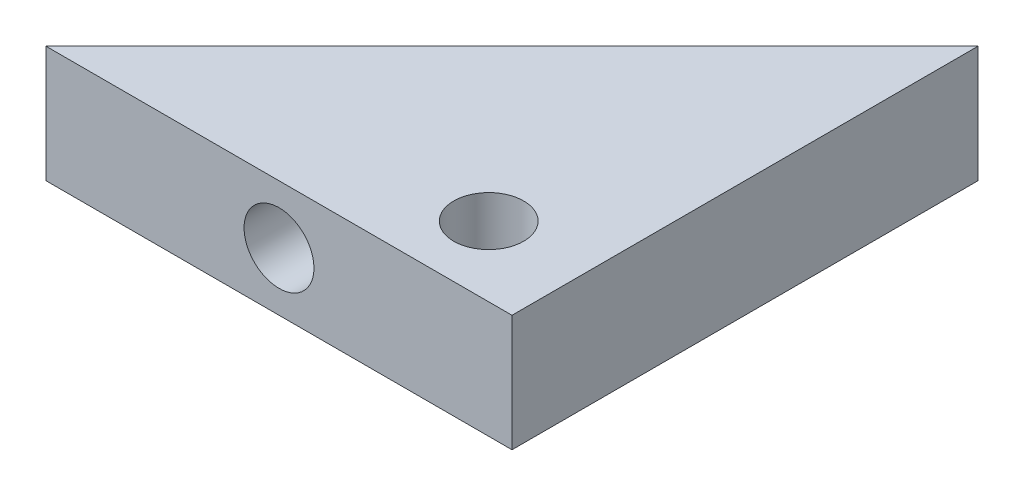
ISO-10303-21;
HEADER;
FILE_DESCRIPTION(('STEP AP214'),'2;1');
FILE_NAME('part.step','',(''),(''),'','','');
FILE_SCHEMA(('AUTOMOTIVE_DESIGN { 1 0 10303 214 1 1 1 1 }'));
ENDSEC;
DATA;
#1=APPLICATION_CONTEXT('core data for automotive mechanical design processes');
#2=APPLICATION_PROTOCOL_DEFINITION('international standard','automotive_design',2000,#1);
#3=PRODUCT_CONTEXT('',#1,'mechanical');
#4=PRODUCT('Part','Part','',(#3));
#5=PRODUCT_RELATED_PRODUCT_CATEGORY('part','',(#4));
#6=PRODUCT_DEFINITION_FORMATION('','',#4);
#7=PRODUCT_DEFINITION_CONTEXT('part definition',#1,'design');
#8=PRODUCT_DEFINITION('design','',#6,#7);
#9=PRODUCT_DEFINITION_SHAPE('','',#8);
#10=(LENGTH_UNIT() NAMED_UNIT(*) SI_UNIT(.MILLI.,.METRE.));
#11=(NAMED_UNIT(*) PLANE_ANGLE_UNIT() SI_UNIT($,.RADIAN.));
#12=(NAMED_UNIT(*) SI_UNIT($,.STERADIAN.) SOLID_ANGLE_UNIT());
#13=UNCERTAINTY_MEASURE_WITH_UNIT(LENGTH_MEASURE(1.E-05),#10,'distance_accuracy_value','');
#14=(GEOMETRIC_REPRESENTATION_CONTEXT(3) GLOBAL_UNCERTAINTY_ASSIGNED_CONTEXT((#13)) GLOBAL_UNIT_ASSIGNED_CONTEXT((#10,
#11,#12)) REPRESENTATION_CONTEXT('',''));
#15=CARTESIAN_POINT('',(0.,0.,0.));
#16=DIRECTION('',(0.,0.,1.));
#17=DIRECTION('',(1.,0.,0.));
#18=AXIS2_PLACEMENT_3D('',#15,#16,#17);
#19=CARTESIAN_POINT('',(0.,5.,0.));
#20=DIRECTION('',(-1.,0.,0.));
#21=DIRECTION('',(0.,0.,1.));
#22=AXIS2_PLACEMENT_3D('',#19,#20,#21);
#23=PLANE('',#22);
#24=DIRECTION('',(0.,0.,-1.));
#25=VECTOR('',#24,1.);
#26=CARTESIAN_POINT('',(0.,0.,0.));
#27=LINE('',#26,#25);
#28=CARTESIAN_POINT('',(0.,0.,0.));
#29=VERTEX_POINT('',#28);
#30=CARTESIAN_POINT('',(0.,0.,-19.9999999999998));
#31=VERTEX_POINT('',#30);
#32=EDGE_CURVE('E90',#29,#31,#27,.T.);
#33=ORIENTED_EDGE('',*,*,#32,.T.);
#34=DIRECTION('',(0.,-1.,0.));
#35=VECTOR('',#34,1.);
#36=CARTESIAN_POINT('',(0.,5.,-19.9999999999998));
#37=LINE('',#36,#35);
#38=CARTESIAN_POINT('',(0.,5.,-19.9999999999998));
#39=VERTEX_POINT('',#38);
#40=EDGE_CURVE('E11',#39,#31,#37,.T.);
#41=ORIENTED_EDGE('',*,*,#40,.F.);
#42=DIRECTION('',(0.,0.,-1.));
#43=VECTOR('',#42,1.);
#44=CARTESIAN_POINT('',(0.,5.,0.));
#45=LINE('',#44,#43);
#46=CARTESIAN_POINT('',(0.,5.,0.));
#47=VERTEX_POINT('',#46);
#48=EDGE_CURVE('E82',#47,#39,#45,.T.);
#49=ORIENTED_EDGE('',*,*,#48,.F.);
#50=DIRECTION('',(0.,-1.,0.));
#51=VECTOR('',#50,1.);
#52=CARTESIAN_POINT('',(0.,5.,0.));
#53=LINE('',#52,#51);
#54=EDGE_CURVE('E91',#47,#29,#53,.T.);
#55=ORIENTED_EDGE('',*,*,#54,.T.);
#56=EDGE_LOOP('',(#33,#41,#49,#55));
#57=FACE_BOUND('',#56,.T.);
#58=ADVANCED_FACE('F39',(#57),#23,.F.);
#59=CARTESIAN_POINT('',(-20.,5.,0.));
#60=DIRECTION('',(0.707106781186544,0.,0.707106781186551));
#61=DIRECTION('',(0.707106781186551,0.,-0.707106781186544));
#62=AXIS2_PLACEMENT_3D('',#59,#60,#61);
#63=PLANE('',#62);
#64=CARTESIAN_POINT('',(-7.62563132923535,2.5,-12.3743686707645));
#65=DIRECTION('',(-0.707106781186544,0.,-0.707106781186551));
#66=DIRECTION('',(-0.707106781186551,0.,0.707106781186544));
#67=AXIS2_PLACEMENT_3D('',#64,#65,#66);
#68=CIRCLE('',#67,1.5);
#69=CARTESIAN_POINT('',(-8.68629150101518,2.5,-11.3137084989847));
#70=VERTEX_POINT('',#69);
#71=EDGE_CURVE('E137',#70,#70,#68,.T.);
#72=ORIENTED_EDGE('',*,*,#71,.F.);
#73=EDGE_LOOP('',(#72));
#74=FACE_BOUND('',#73,.T.);
#75=DIRECTION('',(-0.707106781186551,0.,0.707106781186544));
#76=VECTOR('',#75,1.);
#77=CARTESIAN_POINT('',(-20.,0.,0.));
#78=LINE('',#77,#76);
#79=CARTESIAN_POINT('',(-20.,0.,0.));
#80=VERTEX_POINT('',#79);
#81=EDGE_CURVE('E69',#31,#80,#78,.T.);
#82=ORIENTED_EDGE('',*,*,#81,.T.);
#83=DIRECTION('',(0.,-1.,0.));
#84=VECTOR('',#83,1.);
#85=CARTESIAN_POINT('',(-20.,5.,0.));
#86=LINE('',#85,#84);
#87=CARTESIAN_POINT('',(-20.,5.,0.));
#88=VERTEX_POINT('',#87);
#89=EDGE_CURVE('E49',#88,#80,#86,.T.);
#90=ORIENTED_EDGE('',*,*,#89,.F.);
#91=DIRECTION('',(-0.707106781186551,0.,0.707106781186544));
#92=VECTOR('',#91,1.);
#93=CARTESIAN_POINT('',(-20.,5.,0.));
#94=LINE('',#93,#92);
#95=EDGE_CURVE('E77',#39,#88,#94,.T.);
#96=ORIENTED_EDGE('',*,*,#95,.F.);
#97=ORIENTED_EDGE('',*,*,#40,.T.);
#98=EDGE_LOOP('',(#82,#90,#96,#97));
#99=FACE_BOUND('',#98,.T.);
#100=ADVANCED_FACE('F78',(#74,#99),#63,.F.);
#101=CARTESIAN_POINT('',(0.,5.,0.));
#102=DIRECTION('',(0.,0.,-1.));
#103=DIRECTION('',(-1.,0.,0.));
#104=AXIS2_PLACEMENT_3D('',#101,#102,#103);
#105=PLANE('',#104);
#106=CARTESIAN_POINT('',(-10.,2.5,0.));
#107=DIRECTION('',(0.,0.,1.));
#108=DIRECTION('',(1.,0.,0.));
#109=AXIS2_PLACEMENT_3D('',#106,#107,#108);
#110=CIRCLE('',#109,1.5);
#111=CARTESIAN_POINT('',(-8.5,2.5,0.));
#112=VERTEX_POINT('',#111);
#113=EDGE_CURVE('E100',#112,#112,#110,.T.);
#114=ORIENTED_EDGE('',*,*,#113,.F.);
#115=EDGE_LOOP('',(#114));
#116=FACE_BOUND('',#115,.T.);
#117=DIRECTION('',(1.,0.,0.));
#118=VECTOR('',#117,1.);
#119=CARTESIAN_POINT('',(0.,0.,0.));
#120=LINE('',#119,#118);
#121=EDGE_CURVE('E74',#80,#29,#120,.T.);
#122=ORIENTED_EDGE('',*,*,#121,.T.);
#123=ORIENTED_EDGE('',*,*,#54,.F.);
#124=DIRECTION('',(1.,0.,0.));
#125=VECTOR('',#124,1.);
#126=CARTESIAN_POINT('',(0.,5.,0.));
#127=LINE('',#126,#125);
#128=EDGE_CURVE('E57',#88,#47,#127,.T.);
#129=ORIENTED_EDGE('',*,*,#128,.F.);
#130=ORIENTED_EDGE('',*,*,#89,.T.);
#131=EDGE_LOOP('',(#122,#123,#129,#130));
#132=FACE_BOUND('',#131,.T.);
#133=ADVANCED_FACE('F109',(#116,#132),#105,.F.);
#134=CARTESIAN_POINT('',(0.,5.,0.));
#135=DIRECTION('',(0.,1.,0.));
#136=DIRECTION('',(0.,0.,1.));
#137=AXIS2_PLACEMENT_3D('',#134,#135,#136);
#138=PLANE('',#137);
#139=CARTESIAN_POINT('',(-4.,5.,-3.));
#140=DIRECTION('',(0.,1.,0.));
#141=DIRECTION('',(0.,0.,1.));
#142=AXIS2_PLACEMENT_3D('',#139,#140,#141);
#143=CIRCLE('',#142,1.5);
#144=CARTESIAN_POINT('',(-4.,5.,-1.5));
#145=VERTEX_POINT('',#144);
#146=EDGE_CURVE('E146',#145,#145,#143,.T.);
#147=ORIENTED_EDGE('',*,*,#146,.F.);
#148=EDGE_LOOP('',(#147));
#149=FACE_BOUND('',#148,.T.);
#150=ORIENTED_EDGE('',*,*,#48,.T.);
#151=ORIENTED_EDGE('',*,*,#95,.T.);
#152=ORIENTED_EDGE('',*,*,#128,.T.);
#153=EDGE_LOOP('',(#150,#151,#152));
#154=FACE_BOUND('',#153,.T.);
#155=ADVANCED_FACE('F85',(#149,#154),#138,.T.);
#156=CARTESIAN_POINT('',(0.,0.,0.));
#157=DIRECTION('',(0.,1.,0.));
#158=DIRECTION('',(0.,0.,1.));
#159=AXIS2_PLACEMENT_3D('',#156,#157,#158);
#160=PLANE('',#159);
#161=CARTESIAN_POINT('',(-4.,0.,-3.));
#162=DIRECTION('',(0.,1.,0.));
#163=DIRECTION('',(0.,0.,1.));
#164=AXIS2_PLACEMENT_3D('',#161,#162,#163);
#165=CIRCLE('',#164,1.5);
#166=CARTESIAN_POINT('',(-4.,0.,-1.5));
#167=VERTEX_POINT('',#166);
#168=EDGE_CURVE('E42',#167,#167,#165,.T.);
#169=ORIENTED_EDGE('',*,*,#168,.T.);
#170=EDGE_LOOP('',(#169));
#171=FACE_BOUND('',#170,.T.);
#172=ORIENTED_EDGE('',*,*,#32,.F.);
#173=ORIENTED_EDGE('',*,*,#121,.F.);
#174=ORIENTED_EDGE('',*,*,#81,.F.);
#175=EDGE_LOOP('',(#172,#173,#174));
#176=FACE_BOUND('',#175,.T.);
#177=ADVANCED_FACE('F110',(#171,#176),#160,.F.);
#178=CARTESIAN_POINT('',(-10.,2.5,-7.));
#179=DIRECTION('',(0.,0.,1.));
#180=DIRECTION('',(1.,0.,0.));
#181=AXIS2_PLACEMENT_3D('',#178,#179,#180);
#182=CYLINDRICAL_SURFACE('',#181,1.5);
#183=CARTESIAN_POINT('',(-10.,2.5,-7.));
#184=DIRECTION('',(0.,0.,1.));
#185=DIRECTION('',(1.,0.,0.));
#186=AXIS2_PLACEMENT_3D('',#183,#184,#185);
#187=CIRCLE('',#186,1.5);
#188=CARTESIAN_POINT('',(-8.5,2.5,-7.));
#189=VERTEX_POINT('',#188);
#190=EDGE_CURVE('E94',#189,#189,#187,.T.);
#191=ORIENTED_EDGE('',*,*,#190,.F.);
#192=EDGE_LOOP('',(#191));
#193=FACE_BOUND('',#192,.T.);
#194=ORIENTED_EDGE('',*,*,#113,.T.);
#195=EDGE_LOOP('',(#194));
#196=FACE_BOUND('',#195,.T.);
#197=ADVANCED_FACE('F112',(#193,#196),#182,.F.);
#198=CARTESIAN_POINT('',(-10.,2.5,-7.));
#199=DIRECTION('',(0.,0.,1.));
#200=DIRECTION('',(1.,0.,0.));
#201=AXIS2_PLACEMENT_3D('',#198,#199,#200);
#202=PLANE('',#201);
#203=ORIENTED_EDGE('',*,*,#190,.T.);
#204=EDGE_LOOP('',(#203));
#205=FACE_BOUND('',#204,.T.);
#206=ADVANCED_FACE('F119',(#205),#202,.T.);
#207=CARTESIAN_POINT('',(-2.67588386092955,2.5,-7.42462120245866));
#208=DIRECTION('',(-0.707106781186544,0.,-0.707106781186551));
#209=DIRECTION('',(-0.707106781186551,0.,0.707106781186544));
#210=AXIS2_PLACEMENT_3D('',#207,#208,#209);
#211=CYLINDRICAL_SURFACE('',#210,1.5);
#212=CARTESIAN_POINT('',(-2.67588386092955,2.5,-7.42462120245866));
#213=DIRECTION('',(-0.707106781186544,0.,-0.707106781186551));
#214=DIRECTION('',(-0.707106781186551,0.,0.707106781186544));
#215=AXIS2_PLACEMENT_3D('',#212,#213,#214);
#216=CIRCLE('',#215,1.5);
#217=CARTESIAN_POINT('',(-3.73654403270937,2.5,-6.36396103067884));
#218=VERTEX_POINT('',#217);
#219=EDGE_CURVE('E140',#218,#218,#216,.T.);
#220=ORIENTED_EDGE('',*,*,#219,.F.);
#221=EDGE_LOOP('',(#220));
#222=FACE_BOUND('',#221,.T.);
#223=ORIENTED_EDGE('',*,*,#71,.T.);
#224=EDGE_LOOP('',(#223));
#225=FACE_BOUND('',#224,.T.);
#226=ADVANCED_FACE('F166',(#222,#225),#211,.F.);
#227=CARTESIAN_POINT('',(-2.67588386092955,2.5,-7.42462120245866));
#228=DIRECTION('',(-0.707106781186544,0.,-0.707106781186551));
#229=DIRECTION('',(-0.707106781186551,0.,0.707106781186544));
#230=AXIS2_PLACEMENT_3D('',#227,#228,#229);
#231=PLANE('',#230);
#232=ORIENTED_EDGE('',*,*,#219,.T.);
#233=EDGE_LOOP('',(#232));
#234=FACE_BOUND('',#233,.T.);
#235=ADVANCED_FACE('F160',(#234),#231,.T.);
#236=CARTESIAN_POINT('',(-4.,-2.,-3.));
#237=DIRECTION('',(0.,1.,0.));
#238=DIRECTION('',(0.,0.,1.));
#239=AXIS2_PLACEMENT_3D('',#236,#237,#238);
#240=CYLINDRICAL_SURFACE('',#239,1.5);
#241=ORIENTED_EDGE('',*,*,#146,.T.);
#242=EDGE_LOOP('',(#241));
#243=FACE_BOUND('',#242,.T.);
#244=ORIENTED_EDGE('',*,*,#168,.F.);
#245=EDGE_LOOP('',(#244));
#246=FACE_BOUND('',#245,.T.);
#247=ADVANCED_FACE('F157',(#243,#246),#240,.F.);
#248=CLOSED_SHELL('',(#58,#100,#133,#155,#177,#197,#206,#226,#235,#247));
#249=MANIFOLD_SOLID_BREP('B2',#248);
#250=ADVANCED_BREP_SHAPE_REPRESENTATION('',(#18,#249),#14);
#251=SHAPE_DEFINITION_REPRESENTATION(#9,#250);
ENDSEC;
END-ISO-10303-21;
